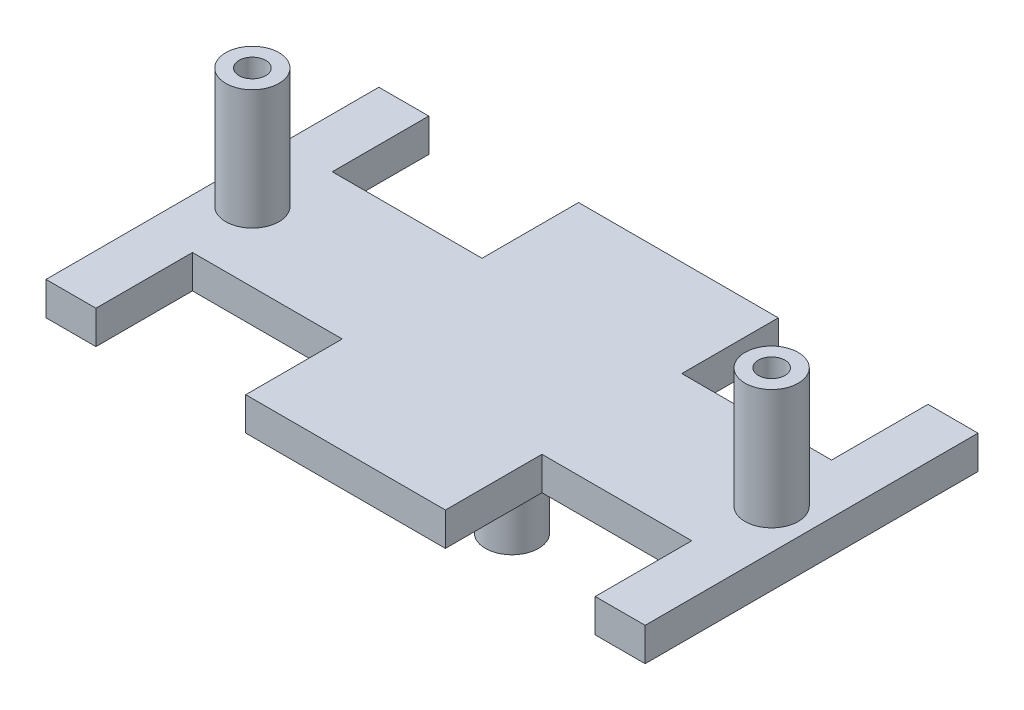
ISO-10303-21;
HEADER;
FILE_DESCRIPTION(('STEP AP214'),'2;1');
FILE_NAME('part.step','',(''),(''),'','','');
FILE_SCHEMA(('AUTOMOTIVE_DESIGN { 1 0 10303 214 1 1 1 1 }'));
ENDSEC;
DATA;
#1=APPLICATION_CONTEXT('core data for automotive mechanical design processes');
#2=APPLICATION_PROTOCOL_DEFINITION('international standard','automotive_design',2000,#1);
#3=PRODUCT_CONTEXT('',#1,'mechanical');
#4=PRODUCT('Part','Part','',(#3));
#5=PRODUCT_RELATED_PRODUCT_CATEGORY('part','',(#4));
#6=PRODUCT_DEFINITION_FORMATION('','',#4);
#7=PRODUCT_DEFINITION_CONTEXT('part definition',#1,'design');
#8=PRODUCT_DEFINITION('design','',#6,#7);
#9=PRODUCT_DEFINITION_SHAPE('','',#8);
#10=(LENGTH_UNIT() NAMED_UNIT(*) SI_UNIT(.MILLI.,.METRE.));
#11=(NAMED_UNIT(*) PLANE_ANGLE_UNIT() SI_UNIT($,.RADIAN.));
#12=(NAMED_UNIT(*) SI_UNIT($,.STERADIAN.) SOLID_ANGLE_UNIT());
#13=UNCERTAINTY_MEASURE_WITH_UNIT(LENGTH_MEASURE(1.E-05),#10,'distance_accuracy_value','');
#14=(GEOMETRIC_REPRESENTATION_CONTEXT(3) GLOBAL_UNCERTAINTY_ASSIGNED_CONTEXT((#13)) GLOBAL_UNIT_ASSIGNED_CONTEXT((#10,
#11,#12)) REPRESENTATION_CONTEXT('',''));
#15=CARTESIAN_POINT('',(0.,0.,0.));
#16=DIRECTION('',(0.,0.,1.));
#17=DIRECTION('',(1.,0.,0.));
#18=AXIS2_PLACEMENT_3D('',#15,#16,#17);
#19=CARTESIAN_POINT('',(0.,5.,0.));
#20=DIRECTION('',(0.,1.,0.));
#21=DIRECTION('',(0.,0.,1.));
#22=AXIS2_PLACEMENT_3D('',#19,#20,#21);
#23=PLANE('',#22);
#24=CARTESIAN_POINT('',(-113.593596059113,5.,-13.9039408866995));
#25=DIRECTION('',(0.,1.,0.));
#26=DIRECTION('',(0.,0.,1.));
#27=AXIS2_PLACEMENT_3D('',#24,#25,#26);
#28=CIRCLE('',#27,4.);
#29=CARTESIAN_POINT('',(-113.593596059113,5.,-9.90394088669952));
#30=VERTEX_POINT('',#29);
#31=EDGE_CURVE('E47',#30,#30,#28,.T.);
#32=ORIENTED_EDGE('',*,*,#31,.F.);
#33=EDGE_LOOP('',(#32));
#34=FACE_BOUND('',#33,.T.);
#35=CARTESIAN_POINT('',(-35.5935960591133,5.,-13.9039408866995));
#36=DIRECTION('',(0.,1.,0.));
#37=DIRECTION('',(0.,0.,1.));
#38=AXIS2_PLACEMENT_3D('',#35,#36,#37);
#39=CIRCLE('',#38,4.);
#40=CARTESIAN_POINT('',(-35.5935960591133,5.,-9.90394088669952));
#41=VERTEX_POINT('',#40);
#42=EDGE_CURVE('E204',#41,#41,#39,.T.);
#43=ORIENTED_EDGE('',*,*,#42,.F.);
#44=EDGE_LOOP('',(#43));
#45=FACE_BOUND('',#44,.T.);
#46=DIRECTION('',(-1.,0.,0.));
#47=VECTOR('',#46,1.);
#48=CARTESIAN_POINT('',(-37.0935960591133,5.,-24.4039408866995));
#49=LINE('',#48,#47);
#50=CARTESIAN_POINT('',(-37.0935960591133,5.,-24.4039408866995));
#51=VERTEX_POINT('',#50);
#52=CARTESIAN_POINT('',(-59.5935960591133,5.,-24.4039408866995));
#53=VERTEX_POINT('',#52);
#54=EDGE_CURVE('E201',#51,#53,#49,.T.);
#55=ORIENTED_EDGE('',*,*,#54,.T.);
#56=DIRECTION('',(0.,0.,-1.));
#57=VECTOR('',#56,1.);
#58=CARTESIAN_POINT('',(-59.5935960591133,5.,-24.4039408866995));
#59=LINE('',#58,#57);
#60=CARTESIAN_POINT('',(-59.5935960591133,5.,-38.9039408866995));
#61=VERTEX_POINT('',#60);
#62=EDGE_CURVE('E193',#53,#61,#59,.T.);
#63=ORIENTED_EDGE('',*,*,#62,.T.);
#64=DIRECTION('',(-1.,0.,0.));
#65=VECTOR('',#64,1.);
#66=CARTESIAN_POINT('',(-119.593596059113,5.,-38.9039408866995));
#67=LINE('',#66,#65);
#68=CARTESIAN_POINT('',(-89.5935960591133,5.,-38.9039408866995));
#69=VERTEX_POINT('',#68);
#70=EDGE_CURVE('E301',#61,#69,#67,.T.);
#71=ORIENTED_EDGE('',*,*,#70,.T.);
#72=DIRECTION('',(0.,0.,-1.));
#73=VECTOR('',#72,1.);
#74=CARTESIAN_POINT('',(-89.5935960591133,5.,-24.4039408866995));
#75=LINE('',#74,#73);
#76=CARTESIAN_POINT('',(-89.5935960591133,5.,-24.4039408866995));
#77=VERTEX_POINT('',#76);
#78=EDGE_CURVE('E259',#77,#69,#75,.T.);
#79=ORIENTED_EDGE('',*,*,#78,.F.);
#80=DIRECTION('',(1.,0.,0.));
#81=VECTOR('',#80,1.);
#82=CARTESIAN_POINT('',(-90.0935960591133,5.,-24.4039408866995));
#83=LINE('',#82,#81);
#84=CARTESIAN_POINT('',(-112.093596059113,5.,-24.4039408866995));
#85=VERTEX_POINT('',#84);
#86=EDGE_CURVE('E269',#85,#77,#83,.T.);
#87=ORIENTED_EDGE('',*,*,#86,.F.);
#88=DIRECTION('',(0.,0.,1.));
#89=VECTOR('',#88,1.);
#90=CARTESIAN_POINT('',(-112.093596059113,5.,-24.4039408866995));
#91=LINE('',#90,#89);
#92=CARTESIAN_POINT('',(-112.093596059113,5.,-38.9039408866995));
#93=VERTEX_POINT('',#92);
#94=EDGE_CURVE('E278',#93,#85,#91,.T.);
#95=ORIENTED_EDGE('',*,*,#94,.F.);
#96=CARTESIAN_POINT('',(-119.593596059113,5.,-38.9039408866995));
#97=VERTEX_POINT('',#96);
#98=EDGE_CURVE('E295',#93,#97,#67,.T.);
#99=ORIENTED_EDGE('',*,*,#98,.T.);
#100=DIRECTION('',(0.,0.,1.));
#101=VECTOR('',#100,1.);
#102=CARTESIAN_POINT('',(-119.593596059113,5.,-38.9039408866995));
#103=LINE('',#102,#101);
#104=CARTESIAN_POINT('',(-119.593596059113,5.,11.0960591133005));
#105=VERTEX_POINT('',#104);
#106=EDGE_CURVE('E300',#97,#105,#103,.T.);
#107=ORIENTED_EDGE('',*,*,#106,.T.);
#108=DIRECTION('',(1.,0.,0.));
#109=VECTOR('',#108,1.);
#110=CARTESIAN_POINT('',(-119.593596059113,5.,11.0960591133005));
#111=LINE('',#110,#109);
#112=CARTESIAN_POINT('',(-112.093596059113,5.,11.0960591133005));
#113=VERTEX_POINT('',#112);
#114=EDGE_CURVE('E304',#105,#113,#111,.T.);
#115=ORIENTED_EDGE('',*,*,#114,.T.);
#116=DIRECTION('',(0.,0.,-1.));
#117=VECTOR('',#116,1.);
#118=CARTESIAN_POINT('',(-112.093596059113,5.,-3.4039408866995));
#119=LINE('',#118,#117);
#120=CARTESIAN_POINT('',(-112.093596059113,5.,-3.4039408866995));
#121=VERTEX_POINT('',#120);
#122=EDGE_CURVE('E244',#113,#121,#119,.T.);
#123=ORIENTED_EDGE('',*,*,#122,.T.);
#124=DIRECTION('',(1.,0.,0.));
#125=VECTOR('',#124,1.);
#126=CARTESIAN_POINT('',(-112.093596059113,5.,-3.4039408866995));
#127=LINE('',#126,#125);
#128=CARTESIAN_POINT('',(-89.5935960591133,5.,-3.40394088669951));
#129=VERTEX_POINT('',#128);
#130=EDGE_CURVE('E252',#121,#129,#127,.T.);
#131=ORIENTED_EDGE('',*,*,#130,.T.);
#132=DIRECTION('',(0.,0.,1.));
#133=VECTOR('',#132,1.);
#134=CARTESIAN_POINT('',(-89.5935960591133,5.,-3.40394088669951));
#135=LINE('',#134,#133);
#136=CARTESIAN_POINT('',(-89.5935960591133,5.,11.0960591133005));
#137=VERTEX_POINT('',#136);
#138=EDGE_CURVE('E234',#129,#137,#135,.T.);
#139=ORIENTED_EDGE('',*,*,#138,.T.);
#140=CARTESIAN_POINT('',(-59.5935960591133,5.,11.0960591133005));
#141=VERTEX_POINT('',#140);
#142=EDGE_CURVE('E308',#137,#141,#111,.T.);
#143=ORIENTED_EDGE('',*,*,#142,.T.);
#144=DIRECTION('',(0.,0.,1.));
#145=VECTOR('',#144,1.);
#146=CARTESIAN_POINT('',(-59.5935960591133,5.,-3.40394088669951));
#147=LINE('',#146,#145);
#148=CARTESIAN_POINT('',(-59.5935960591133,5.,-3.40394088669951));
#149=VERTEX_POINT('',#148);
#150=EDGE_CURVE('E213',#149,#141,#147,.T.);
#151=ORIENTED_EDGE('',*,*,#150,.F.);
#152=DIRECTION('',(-1.,0.,0.));
#153=VECTOR('',#152,1.);
#154=CARTESIAN_POINT('',(-59.0935960591133,5.,-3.4039408866995));
#155=LINE('',#154,#153);
#156=CARTESIAN_POINT('',(-37.0935960591133,5.,-3.4039408866995));
#157=VERTEX_POINT('',#156);
#158=EDGE_CURVE('E221',#157,#149,#155,.T.);
#159=ORIENTED_EDGE('',*,*,#158,.F.);
#160=DIRECTION('',(0.,0.,-1.));
#161=VECTOR('',#160,1.);
#162=CARTESIAN_POINT('',(-37.0935960591133,5.,-3.4039408866995));
#163=LINE('',#162,#161);
#164=CARTESIAN_POINT('',(-37.0935960591133,5.,11.0960591133005));
#165=VERTEX_POINT('',#164);
#166=EDGE_CURVE('E227',#165,#157,#163,.T.);
#167=ORIENTED_EDGE('',*,*,#166,.F.);
#168=CARTESIAN_POINT('',(-29.5935960591133,5.,11.0960591133005));
#169=VERTEX_POINT('',#168);
#170=EDGE_CURVE('E303',#165,#169,#111,.T.);
#171=ORIENTED_EDGE('',*,*,#170,.T.);
#172=DIRECTION('',(0.,0.,-1.));
#173=VECTOR('',#172,1.);
#174=CARTESIAN_POINT('',(-29.5935960591133,5.,-38.9039408866995));
#175=LINE('',#174,#173);
#176=CARTESIAN_POINT('',(-29.5935960591133,5.,-38.9039408866995));
#177=VERTEX_POINT('',#176);
#178=EDGE_CURVE('E292',#169,#177,#175,.T.);
#179=ORIENTED_EDGE('',*,*,#178,.T.);
#180=CARTESIAN_POINT('',(-37.0935960591133,5.,-38.9039408866995));
#181=VERTEX_POINT('',#180);
#182=EDGE_CURVE('E297',#177,#181,#67,.T.);
#183=ORIENTED_EDGE('',*,*,#182,.T.);
#184=DIRECTION('',(0.,0.,1.));
#185=VECTOR('',#184,1.);
#186=CARTESIAN_POINT('',(-37.0935960591133,5.,-24.4039408866995));
#187=LINE('',#186,#185);
#188=EDGE_CURVE('E54',#181,#51,#187,.T.);
#189=ORIENTED_EDGE('',*,*,#188,.T.);
#190=EDGE_LOOP('',(#55,#63,#71,#79,#87,#95,#99,#107,#115,#123,#131,#139,#143,#151,#159,#167,
#171,#179,#183,#189));
#191=FACE_BOUND('',#190,.T.);
#192=ADVANCED_FACE('F39',(#34,#45,#191),#23,.T.);
#193=CARTESIAN_POINT('',(0.,0.,0.));
#194=DIRECTION('',(0.,1.,0.));
#195=DIRECTION('',(0.,0.,1.));
#196=AXIS2_PLACEMENT_3D('',#193,#194,#195);
#197=PLANE('',#196);
#198=CARTESIAN_POINT('',(-74.5935960591133,0.,-13.9039408866995));
#199=DIRECTION('',(0.,1.,0.));
#200=DIRECTION('',(0.,0.,1.));
#201=AXIS2_PLACEMENT_3D('',#198,#199,#200);
#202=CIRCLE('',#201,4.00000000000001);
#203=CARTESIAN_POINT('',(-74.5935960591133,0.,-9.90394088669951));
#204=VERTEX_POINT('',#203);
#205=EDGE_CURVE('E11',#204,#204,#202,.F.);
#206=ORIENTED_EDGE('',*,*,#205,.F.);
#207=EDGE_LOOP('',(#206));
#208=FACE_BOUND('',#207,.T.);
#209=DIRECTION('',(0.,0.,-1.));
#210=VECTOR('',#209,1.);
#211=CARTESIAN_POINT('',(-59.5935960591133,0.,-24.4039408866995));
#212=LINE('',#211,#210);
#213=CARTESIAN_POINT('',(-59.5935960591133,0.,-24.4039408866995));
#214=VERTEX_POINT('',#213);
#215=CARTESIAN_POINT('',(-59.5935960591133,0.,-38.9039408866995));
#216=VERTEX_POINT('',#215);
#217=EDGE_CURVE('E187',#214,#216,#212,.T.);
#218=ORIENTED_EDGE('',*,*,#217,.F.);
#219=DIRECTION('',(-1.,0.,0.));
#220=VECTOR('',#219,1.);
#221=CARTESIAN_POINT('',(-59.0935960591133,0.,-24.4039408866995));
#222=LINE('',#221,#220);
#223=CARTESIAN_POINT('',(-37.0935960591133,0.,-24.4039408866995));
#224=VERTEX_POINT('',#223);
#225=EDGE_CURVE('E176',#224,#214,#222,.T.);
#226=ORIENTED_EDGE('',*,*,#225,.F.);
#227=DIRECTION('',(0.,0.,1.));
#228=VECTOR('',#227,1.);
#229=CARTESIAN_POINT('',(-37.0935960591133,0.,-24.4039408866995));
#230=LINE('',#229,#228);
#231=CARTESIAN_POINT('',(-37.0935960591133,0.,-38.9039408866995));
#232=VERTEX_POINT('',#231);
#233=EDGE_CURVE('E186',#232,#224,#230,.T.);
#234=ORIENTED_EDGE('',*,*,#233,.F.);
#235=DIRECTION('',(-1.,0.,0.));
#236=VECTOR('',#235,1.);
#237=CARTESIAN_POINT('',(-119.593596059113,0.,-38.9039408866995));
#238=LINE('',#237,#236);
#239=CARTESIAN_POINT('',(-29.5935960591133,0.,-38.9039408866995));
#240=VERTEX_POINT('',#239);
#241=EDGE_CURVE('E312',#240,#232,#238,.T.);
#242=ORIENTED_EDGE('',*,*,#241,.F.);
#243=DIRECTION('',(0.,0.,-1.));
#244=VECTOR('',#243,1.);
#245=CARTESIAN_POINT('',(-29.5935960591133,0.,-38.9039408866995));
#246=LINE('',#245,#244);
#247=CARTESIAN_POINT('',(-29.5935960591133,0.,11.0960591133005));
#248=VERTEX_POINT('',#247);
#249=EDGE_CURVE('E285',#248,#240,#246,.T.);
#250=ORIENTED_EDGE('',*,*,#249,.F.);
#251=DIRECTION('',(1.,0.,0.));
#252=VECTOR('',#251,1.);
#253=CARTESIAN_POINT('',(-119.593596059113,0.,11.0960591133005));
#254=LINE('',#253,#252);
#255=CARTESIAN_POINT('',(-37.0935960591133,0.,11.0960591133005));
#256=VERTEX_POINT('',#255);
#257=EDGE_CURVE('E317',#256,#248,#254,.T.);
#258=ORIENTED_EDGE('',*,*,#257,.F.);
#259=DIRECTION('',(0.,0.,-1.));
#260=VECTOR('',#259,1.);
#261=CARTESIAN_POINT('',(-37.0935960591133,0.,-3.4039408866995));
#262=LINE('',#261,#260);
#263=CARTESIAN_POINT('',(-37.0935960591133,0.,-3.4039408866995));
#264=VERTEX_POINT('',#263);
#265=EDGE_CURVE('E220',#256,#264,#262,.T.);
#266=ORIENTED_EDGE('',*,*,#265,.T.);
#267=DIRECTION('',(-1.,0.,0.));
#268=VECTOR('',#267,1.);
#269=CARTESIAN_POINT('',(-37.0935960591133,0.,-3.4039408866995));
#270=LINE('',#269,#268);
#271=CARTESIAN_POINT('',(-59.5935960591133,0.,-3.40394088669951));
#272=VERTEX_POINT('',#271);
#273=EDGE_CURVE('E62',#264,#272,#270,.T.);
#274=ORIENTED_EDGE('',*,*,#273,.T.);
#275=DIRECTION('',(0.,0.,1.));
#276=VECTOR('',#275,1.);
#277=CARTESIAN_POINT('',(-59.5935960591133,0.,-3.40394088669951));
#278=LINE('',#277,#276);
#279=CARTESIAN_POINT('',(-59.5935960591133,0.,11.0960591133005));
#280=VERTEX_POINT('',#279);
#281=EDGE_CURVE('E217',#272,#280,#278,.T.);
#282=ORIENTED_EDGE('',*,*,#281,.T.);
#283=CARTESIAN_POINT('',(-89.5935960591133,0.,11.0960591133005));
#284=VERTEX_POINT('',#283);
#285=EDGE_CURVE('E320',#284,#280,#254,.T.);
#286=ORIENTED_EDGE('',*,*,#285,.F.);
#287=DIRECTION('',(0.,0.,1.));
#288=VECTOR('',#287,1.);
#289=CARTESIAN_POINT('',(-89.5935960591133,0.,-3.40394088669951));
#290=LINE('',#289,#288);
#291=CARTESIAN_POINT('',(-89.5935960591133,0.,-3.40394088669951));
#292=VERTEX_POINT('',#291);
#293=EDGE_CURVE('E241',#292,#284,#290,.T.);
#294=ORIENTED_EDGE('',*,*,#293,.F.);
#295=DIRECTION('',(1.,0.,0.));
#296=VECTOR('',#295,1.);
#297=CARTESIAN_POINT('',(-90.0935960591133,0.,-3.4039408866995));
#298=LINE('',#297,#296);
#299=CARTESIAN_POINT('',(-112.093596059113,0.,-3.4039408866995));
#300=VERTEX_POINT('',#299);
#301=EDGE_CURVE('E243',#300,#292,#298,.T.);
#302=ORIENTED_EDGE('',*,*,#301,.F.);
#303=DIRECTION('',(0.,0.,-1.));
#304=VECTOR('',#303,1.);
#305=CARTESIAN_POINT('',(-112.093596059113,0.,-3.4039408866995));
#306=LINE('',#305,#304);
#307=CARTESIAN_POINT('',(-112.093596059113,0.,11.0960591133005));
#308=VERTEX_POINT('',#307);
#309=EDGE_CURVE('E246',#308,#300,#306,.T.);
#310=ORIENTED_EDGE('',*,*,#309,.F.);
#311=CARTESIAN_POINT('',(-119.593596059113,0.,11.0960591133005));
#312=VERTEX_POINT('',#311);
#313=EDGE_CURVE('E296',#312,#308,#254,.T.);
#314=ORIENTED_EDGE('',*,*,#313,.F.);
#315=DIRECTION('',(0.,0.,1.));
#316=VECTOR('',#315,1.);
#317=CARTESIAN_POINT('',(-119.593596059113,0.,-38.9039408866995));
#318=LINE('',#317,#316);
#319=CARTESIAN_POINT('',(-119.593596059113,0.,-38.9039408866995));
#320=VERTEX_POINT('',#319);
#321=EDGE_CURVE('E315',#320,#312,#318,.T.);
#322=ORIENTED_EDGE('',*,*,#321,.F.);
#323=CARTESIAN_POINT('',(-112.093596059113,0.,-38.9039408866995));
#324=VERTEX_POINT('',#323);
#325=EDGE_CURVE('E311',#324,#320,#238,.T.);
#326=ORIENTED_EDGE('',*,*,#325,.F.);
#327=DIRECTION('',(0.,0.,1.));
#328=VECTOR('',#327,1.);
#329=CARTESIAN_POINT('',(-112.093596059113,0.,-24.4039408866995));
#330=LINE('',#329,#328);
#331=CARTESIAN_POINT('',(-112.093596059113,0.,-24.4039408866995));
#332=VERTEX_POINT('',#331);
#333=EDGE_CURVE('E268',#324,#332,#330,.T.);
#334=ORIENTED_EDGE('',*,*,#333,.T.);
#335=DIRECTION('',(1.,0.,0.));
#336=VECTOR('',#335,1.);
#337=CARTESIAN_POINT('',(-112.093596059113,0.,-24.4039408866995));
#338=LINE('',#337,#336);
#339=CARTESIAN_POINT('',(-89.5935960591133,0.,-24.4039408866995));
#340=VERTEX_POINT('',#339);
#341=EDGE_CURVE('E272',#332,#340,#338,.T.);
#342=ORIENTED_EDGE('',*,*,#341,.T.);
#343=DIRECTION('',(0.,0.,-1.));
#344=VECTOR('',#343,1.);
#345=CARTESIAN_POINT('',(-89.5935960591133,0.,-24.4039408866995));
#346=LINE('',#345,#344);
#347=CARTESIAN_POINT('',(-89.5935960591133,0.,-38.9039408866995));
#348=VERTEX_POINT('',#347);
#349=EDGE_CURVE('E266',#340,#348,#346,.T.);
#350=ORIENTED_EDGE('',*,*,#349,.T.);
#351=EDGE_CURVE('E199',#216,#348,#238,.T.);
#352=ORIENTED_EDGE('',*,*,#351,.F.);
#353=EDGE_LOOP('',(#218,#226,#234,#242,#250,#258,#266,#274,#282,#286,#294,#302,#310,#314,#322,
#326,#334,#342,#350,#352));
#354=FACE_BOUND('',#353,.T.);
#355=ADVANCED_FACE('F197',(#208,#354),#197,.F.);
#356=CARTESIAN_POINT('',(-119.593596059113,5.,-38.9039408866995));
#357=DIRECTION('',(0.,0.,1.));
#358=DIRECTION('',(1.,0.,0.));
#359=AXIS2_PLACEMENT_3D('',#356,#357,#358);
#360=PLANE('',#359);
#361=DIRECTION('',(0.,1.,0.));
#362=VECTOR('',#361,1.);
#363=CARTESIAN_POINT('',(-59.5935960591133,0.,-38.9039408866995));
#364=LINE('',#363,#362);
#365=EDGE_CURVE('E211',#216,#61,#364,.T.);
#366=ORIENTED_EDGE('',*,*,#365,.F.);
#367=ORIENTED_EDGE('',*,*,#351,.T.);
#368=DIRECTION('',(0.,1.,0.));
#369=VECTOR('',#368,1.);
#370=CARTESIAN_POINT('',(-89.5935960591133,0.,-38.9039408866995));
#371=LINE('',#370,#369);
#372=EDGE_CURVE('E275',#348,#69,#371,.T.);
#373=ORIENTED_EDGE('',*,*,#372,.T.);
#374=ORIENTED_EDGE('',*,*,#70,.F.);
#375=EDGE_LOOP('',(#366,#367,#373,#374));
#376=FACE_BOUND('',#375,.T.);
#377=ADVANCED_FACE('F413',(#376),#360,.F.);
#378=DIRECTION('',(0.,1.,0.));
#379=VECTOR('',#378,1.);
#380=CARTESIAN_POINT('',(-37.0935960591133,0.,-38.9039408866995));
#381=LINE('',#380,#379);
#382=EDGE_CURVE('E214',#232,#181,#381,.T.);
#383=ORIENTED_EDGE('',*,*,#382,.T.);
#384=ORIENTED_EDGE('',*,*,#182,.F.);
#385=DIRECTION('',(0.,-1.,0.));
#386=VECTOR('',#385,1.);
#387=CARTESIAN_POINT('',(-29.5935960591133,5.,-38.9039408866995));
#388=LINE('',#387,#386);
#389=EDGE_CURVE('E329',#177,#240,#388,.T.);
#390=ORIENTED_EDGE('',*,*,#389,.T.);
#391=ORIENTED_EDGE('',*,*,#241,.T.);
#392=EDGE_LOOP('',(#383,#384,#390,#391));
#393=FACE_BOUND('',#392,.T.);
#394=ADVANCED_FACE('F346',(#393),#360,.F.);
#395=CARTESIAN_POINT('',(-119.593596059113,5.,11.0960591133005));
#396=DIRECTION('',(0.,0.,-1.));
#397=DIRECTION('',(-1.,0.,0.));
#398=AXIS2_PLACEMENT_3D('',#395,#396,#397);
#399=PLANE('',#398);
#400=ORIENTED_EDGE('',*,*,#285,.T.);
#401=DIRECTION('',(0.,1.,0.));
#402=VECTOR('',#401,1.);
#403=CARTESIAN_POINT('',(-59.5935960591133,0.,11.0960591133005));
#404=LINE('',#403,#402);
#405=EDGE_CURVE('E225',#280,#141,#404,.T.);
#406=ORIENTED_EDGE('',*,*,#405,.T.);
#407=ORIENTED_EDGE('',*,*,#142,.F.);
#408=DIRECTION('',(0.,1.,0.));
#409=VECTOR('',#408,1.);
#410=CARTESIAN_POINT('',(-89.5935960591133,0.,11.0960591133005));
#411=LINE('',#410,#409);
#412=EDGE_CURVE('E257',#284,#137,#411,.T.);
#413=ORIENTED_EDGE('',*,*,#412,.F.);
#414=EDGE_LOOP('',(#400,#406,#407,#413));
#415=FACE_BOUND('',#414,.T.);
#416=ADVANCED_FACE('F360',(#415),#399,.F.);
#417=ORIENTED_EDGE('',*,*,#170,.F.);
#418=DIRECTION('',(0.,1.,0.));
#419=VECTOR('',#418,1.);
#420=CARTESIAN_POINT('',(-37.0935960591133,0.,11.0960591133005));
#421=LINE('',#420,#419);
#422=EDGE_CURVE('E237',#256,#165,#421,.T.);
#423=ORIENTED_EDGE('',*,*,#422,.F.);
#424=ORIENTED_EDGE('',*,*,#257,.T.);
#425=DIRECTION('',(0.,-1.,0.));
#426=VECTOR('',#425,1.);
#427=CARTESIAN_POINT('',(-29.5935960591133,5.,11.0960591133005));
#428=LINE('',#427,#426);
#429=EDGE_CURVE('E307',#169,#248,#428,.T.);
#430=ORIENTED_EDGE('',*,*,#429,.F.);
#431=EDGE_LOOP('',(#417,#423,#424,#430));
#432=FACE_BOUND('',#431,.T.);
#433=ADVANCED_FACE('F354',(#432),#399,.F.);
#434=DIRECTION('',(0.,1.,0.));
#435=VECTOR('',#434,1.);
#436=CARTESIAN_POINT('',(-112.093596059113,0.,11.0960591133005));
#437=LINE('',#436,#435);
#438=EDGE_CURVE('E260',#308,#113,#437,.T.);
#439=ORIENTED_EDGE('',*,*,#438,.T.);
#440=ORIENTED_EDGE('',*,*,#114,.F.);
#441=DIRECTION('',(0.,-1.,0.));
#442=VECTOR('',#441,1.);
#443=CARTESIAN_POINT('',(-119.593596059113,5.,11.0960591133005));
#444=LINE('',#443,#442);
#445=EDGE_CURVE('E323',#105,#312,#444,.T.);
#446=ORIENTED_EDGE('',*,*,#445,.T.);
#447=ORIENTED_EDGE('',*,*,#313,.T.);
#448=EDGE_LOOP('',(#439,#440,#446,#447));
#449=FACE_BOUND('',#448,.T.);
#450=ADVANCED_FACE('F417',(#449),#399,.F.);
#451=CARTESIAN_POINT('',(-29.5935960591133,5.,-38.9039408866995));
#452=DIRECTION('',(-1.,0.,0.));
#453=DIRECTION('',(0.,0.,1.));
#454=AXIS2_PLACEMENT_3D('',#451,#452,#453);
#455=PLANE('',#454);
#456=ORIENTED_EDGE('',*,*,#249,.T.);
#457=ORIENTED_EDGE('',*,*,#389,.F.);
#458=ORIENTED_EDGE('',*,*,#178,.F.);
#459=ORIENTED_EDGE('',*,*,#429,.T.);
#460=EDGE_LOOP('',(#456,#457,#458,#459));
#461=FACE_BOUND('',#460,.T.);
#462=ADVANCED_FACE('F41',(#461),#455,.F.);
#463=ORIENTED_EDGE('',*,*,#98,.F.);
#464=DIRECTION('',(0.,1.,0.));
#465=VECTOR('',#464,1.);
#466=CARTESIAN_POINT('',(-112.093596059113,0.,-38.9039408866995));
#467=LINE('',#466,#465);
#468=EDGE_CURVE('E288',#324,#93,#467,.T.);
#469=ORIENTED_EDGE('',*,*,#468,.F.);
#470=ORIENTED_EDGE('',*,*,#325,.T.);
#471=DIRECTION('',(0.,-1.,0.));
#472=VECTOR('',#471,1.);
#473=CARTESIAN_POINT('',(-119.593596059113,5.,-38.9039408866995));
#474=LINE('',#473,#472);
#475=EDGE_CURVE('E326',#97,#320,#474,.T.);
#476=ORIENTED_EDGE('',*,*,#475,.F.);
#477=EDGE_LOOP('',(#463,#469,#470,#476));
#478=FACE_BOUND('',#477,.T.);
#479=ADVANCED_FACE('F419',(#478),#360,.F.);
#480=CARTESIAN_POINT('',(-119.593596059113,5.,-38.9039408866995));
#481=DIRECTION('',(1.,0.,0.));
#482=DIRECTION('',(0.,0.,-1.));
#483=AXIS2_PLACEMENT_3D('',#480,#481,#482);
#484=PLANE('',#483);
#485=ORIENTED_EDGE('',*,*,#321,.T.);
#486=ORIENTED_EDGE('',*,*,#445,.F.);
#487=ORIENTED_EDGE('',*,*,#106,.F.);
#488=ORIENTED_EDGE('',*,*,#475,.T.);
#489=EDGE_LOOP('',(#485,#486,#487,#488));
#490=FACE_BOUND('',#489,.T.);
#491=ADVANCED_FACE('F408',(#490),#484,.F.);
#492=CARTESIAN_POINT('',(-89.5935960591133,0.,-24.4039408866995));
#493=DIRECTION('',(1.,0.,0.));
#494=DIRECTION('',(0.,0.,-1.));
#495=AXIS2_PLACEMENT_3D('',#492,#493,#494);
#496=PLANE('',#495);
#497=ORIENTED_EDGE('',*,*,#78,.T.);
#498=ORIENTED_EDGE('',*,*,#372,.F.);
#499=ORIENTED_EDGE('',*,*,#349,.F.);
#500=DIRECTION('',(0.,1.,0.));
#501=VECTOR('',#500,1.);
#502=CARTESIAN_POINT('',(-89.5935960591133,0.,-24.4039408866995));
#503=LINE('',#502,#501);
#504=EDGE_CURVE('E283',#340,#77,#503,.T.);
#505=ORIENTED_EDGE('',*,*,#504,.T.);
#506=EDGE_LOOP('',(#497,#498,#499,#505));
#507=FACE_BOUND('',#506,.T.);
#508=ADVANCED_FACE('F402',(#507),#496,.F.);
#509=CARTESIAN_POINT('',(-90.0935960591133,0.,-24.4039408866995));
#510=DIRECTION('',(0.,0.,1.));
#511=DIRECTION('',(1.,0.,0.));
#512=AXIS2_PLACEMENT_3D('',#509,#510,#511);
#513=PLANE('',#512);
#514=ORIENTED_EDGE('',*,*,#86,.T.);
#515=ORIENTED_EDGE('',*,*,#504,.F.);
#516=ORIENTED_EDGE('',*,*,#341,.F.);
#517=DIRECTION('',(0.,1.,0.));
#518=VECTOR('',#517,1.);
#519=CARTESIAN_POINT('',(-112.093596059113,0.,-24.4039408866995));
#520=LINE('',#519,#518);
#521=EDGE_CURVE('E286',#332,#85,#520,.T.);
#522=ORIENTED_EDGE('',*,*,#521,.T.);
#523=EDGE_LOOP('',(#514,#515,#516,#522));
#524=FACE_BOUND('',#523,.T.);
#525=ADVANCED_FACE('F399',(#524),#513,.F.);
#526=CARTESIAN_POINT('',(-112.093596059113,0.,-24.4039408866995));
#527=DIRECTION('',(-1.,0.,0.));
#528=DIRECTION('',(0.,0.,1.));
#529=AXIS2_PLACEMENT_3D('',#526,#527,#528);
#530=PLANE('',#529);
#531=ORIENTED_EDGE('',*,*,#94,.T.);
#532=ORIENTED_EDGE('',*,*,#521,.F.);
#533=ORIENTED_EDGE('',*,*,#333,.F.);
#534=ORIENTED_EDGE('',*,*,#468,.T.);
#535=EDGE_LOOP('',(#531,#532,#533,#534));
#536=FACE_BOUND('',#535,.T.);
#537=ADVANCED_FACE('F397',(#536),#530,.F.);
#538=CARTESIAN_POINT('',(-89.5935960591133,0.,-3.40394088669951));
#539=DIRECTION('',(-1.,0.,0.));
#540=DIRECTION('',(0.,0.,1.));
#541=AXIS2_PLACEMENT_3D('',#538,#539,#540);
#542=PLANE('',#541);
#543=ORIENTED_EDGE('',*,*,#138,.F.);
#544=DIRECTION('',(0.,1.,0.));
#545=VECTOR('',#544,1.);
#546=CARTESIAN_POINT('',(-89.5935960591133,0.,-3.40394088669951));
#547=LINE('',#546,#545);
#548=EDGE_CURVE('E249',#292,#129,#547,.T.);
#549=ORIENTED_EDGE('',*,*,#548,.F.);
#550=ORIENTED_EDGE('',*,*,#293,.T.);
#551=ORIENTED_EDGE('',*,*,#412,.T.);
#552=EDGE_LOOP('',(#543,#549,#550,#551));
#553=FACE_BOUND('',#552,.T.);
#554=ADVANCED_FACE('F390',(#553),#542,.T.);
#555=CARTESIAN_POINT('',(-112.093596059113,0.,-3.4039408866995));
#556=DIRECTION('',(1.,0.,0.));
#557=DIRECTION('',(0.,0.,-1.));
#558=AXIS2_PLACEMENT_3D('',#555,#556,#557);
#559=PLANE('',#558);
#560=ORIENTED_EDGE('',*,*,#122,.F.);
#561=ORIENTED_EDGE('',*,*,#438,.F.);
#562=ORIENTED_EDGE('',*,*,#309,.T.);
#563=DIRECTION('',(0.,1.,0.));
#564=VECTOR('',#563,1.);
#565=CARTESIAN_POINT('',(-112.093596059113,0.,-3.4039408866995));
#566=LINE('',#565,#564);
#567=EDGE_CURVE('E263',#300,#121,#566,.T.);
#568=ORIENTED_EDGE('',*,*,#567,.T.);
#569=EDGE_LOOP('',(#560,#561,#562,#568));
#570=FACE_BOUND('',#569,.T.);
#571=ADVANCED_FACE('F387',(#570),#559,.T.);
#572=CARTESIAN_POINT('',(-112.093596059113,0.,-3.4039408866995));
#573=DIRECTION('',(0.,0.,1.));
#574=DIRECTION('',(1.,0.,0.));
#575=AXIS2_PLACEMENT_3D('',#572,#573,#574);
#576=PLANE('',#575);
#577=ORIENTED_EDGE('',*,*,#130,.F.);
#578=ORIENTED_EDGE('',*,*,#567,.F.);
#579=ORIENTED_EDGE('',*,*,#301,.T.);
#580=ORIENTED_EDGE('',*,*,#548,.T.);
#581=EDGE_LOOP('',(#577,#578,#579,#580));
#582=FACE_BOUND('',#581,.T.);
#583=ADVANCED_FACE('F382',(#582),#576,.T.);
#584=CARTESIAN_POINT('',(-59.5935960591133,0.,-3.40394088669951));
#585=DIRECTION('',(-1.,0.,0.));
#586=DIRECTION('',(0.,0.,1.));
#587=AXIS2_PLACEMENT_3D('',#584,#585,#586);
#588=PLANE('',#587);
#589=ORIENTED_EDGE('',*,*,#150,.T.);
#590=ORIENTED_EDGE('',*,*,#405,.F.);
#591=ORIENTED_EDGE('',*,*,#281,.F.);
#592=DIRECTION('',(0.,1.,0.));
#593=VECTOR('',#592,1.);
#594=CARTESIAN_POINT('',(-59.5935960591133,0.,-3.40394088669951));
#595=LINE('',#594,#593);
#596=EDGE_CURVE('E232',#272,#149,#595,.T.);
#597=ORIENTED_EDGE('',*,*,#596,.T.);
#598=EDGE_LOOP('',(#589,#590,#591,#597));
#599=FACE_BOUND('',#598,.T.);
#600=ADVANCED_FACE('F367',(#599),#588,.F.);
#601=CARTESIAN_POINT('',(-59.0935960591133,0.,-3.4039408866995));
#602=DIRECTION('',(0.,0.,-1.));
#603=DIRECTION('',(-1.,0.,0.));
#604=AXIS2_PLACEMENT_3D('',#601,#602,#603);
#605=PLANE('',#604);
#606=ORIENTED_EDGE('',*,*,#158,.T.);
#607=ORIENTED_EDGE('',*,*,#596,.F.);
#608=ORIENTED_EDGE('',*,*,#273,.F.);
#609=DIRECTION('',(0.,1.,0.));
#610=VECTOR('',#609,1.);
#611=CARTESIAN_POINT('',(-37.0935960591133,0.,-3.4039408866995));
#612=LINE('',#611,#610);
#613=EDGE_CURVE('E235',#264,#157,#612,.T.);
#614=ORIENTED_EDGE('',*,*,#613,.T.);
#615=EDGE_LOOP('',(#606,#607,#608,#614));
#616=FACE_BOUND('',#615,.T.);
#617=ADVANCED_FACE('F374',(#616),#605,.F.);
#618=CARTESIAN_POINT('',(-37.0935960591133,0.,-3.4039408866995));
#619=DIRECTION('',(1.,0.,0.));
#620=DIRECTION('',(0.,0.,-1.));
#621=AXIS2_PLACEMENT_3D('',#618,#619,#620);
#622=PLANE('',#621);
#623=ORIENTED_EDGE('',*,*,#166,.T.);
#624=ORIENTED_EDGE('',*,*,#613,.F.);
#625=ORIENTED_EDGE('',*,*,#265,.F.);
#626=ORIENTED_EDGE('',*,*,#422,.T.);
#627=EDGE_LOOP('',(#623,#624,#625,#626));
#628=FACE_BOUND('',#627,.T.);
#629=ADVANCED_FACE('F373',(#628),#622,.F.);
#630=CARTESIAN_POINT('',(-59.5935960591133,0.,-24.4039408866995));
#631=DIRECTION('',(1.,0.,0.));
#632=DIRECTION('',(0.,0.,-1.));
#633=AXIS2_PLACEMENT_3D('',#630,#631,#632);
#634=PLANE('',#633);
#635=ORIENTED_EDGE('',*,*,#62,.F.);
#636=DIRECTION('',(0.,1.,0.));
#637=VECTOR('',#636,1.);
#638=CARTESIAN_POINT('',(-59.5935960591133,0.,-24.4039408866995));
#639=LINE('',#638,#637);
#640=EDGE_CURVE('E180',#214,#53,#639,.T.);
#641=ORIENTED_EDGE('',*,*,#640,.F.);
#642=ORIENTED_EDGE('',*,*,#217,.T.);
#643=ORIENTED_EDGE('',*,*,#365,.T.);
#644=EDGE_LOOP('',(#635,#641,#642,#643));
#645=FACE_BOUND('',#644,.T.);
#646=ADVANCED_FACE('F190',(#645),#634,.T.);
#647=CARTESIAN_POINT('',(-37.0935960591133,0.,-24.4039408866995));
#648=DIRECTION('',(-1.,0.,0.));
#649=DIRECTION('',(0.,0.,1.));
#650=AXIS2_PLACEMENT_3D('',#647,#648,#649);
#651=PLANE('',#650);
#652=ORIENTED_EDGE('',*,*,#188,.F.);
#653=ORIENTED_EDGE('',*,*,#382,.F.);
#654=ORIENTED_EDGE('',*,*,#233,.T.);
#655=DIRECTION('',(0.,1.,0.));
#656=VECTOR('',#655,1.);
#657=CARTESIAN_POINT('',(-37.0935960591133,0.,-24.4039408866995));
#658=LINE('',#657,#656);
#659=EDGE_CURVE('E182',#224,#51,#658,.T.);
#660=ORIENTED_EDGE('',*,*,#659,.T.);
#661=EDGE_LOOP('',(#652,#653,#654,#660));
#662=FACE_BOUND('',#661,.T.);
#663=ADVANCED_FACE('F347',(#662),#651,.T.);
#664=CARTESIAN_POINT('',(-37.0935960591133,0.,-24.4039408866995));
#665=DIRECTION('',(0.,0.,-1.));
#666=DIRECTION('',(-1.,0.,0.));
#667=AXIS2_PLACEMENT_3D('',#664,#665,#666);
#668=PLANE('',#667);
#669=ORIENTED_EDGE('',*,*,#54,.F.);
#670=ORIENTED_EDGE('',*,*,#659,.F.);
#671=ORIENTED_EDGE('',*,*,#225,.T.);
#672=ORIENTED_EDGE('',*,*,#640,.T.);
#673=EDGE_LOOP('',(#669,#670,#671,#672));
#674=FACE_BOUND('',#673,.T.);
#675=ADVANCED_FACE('F179',(#674),#668,.T.);
#676=CARTESIAN_POINT('',(-35.5935960591133,23.,-13.9039408866995));
#677=DIRECTION('',(0.,-1.,0.));
#678=DIRECTION('',(0.,0.,-1.));
#679=AXIS2_PLACEMENT_3D('',#676,#677,#678);
#680=CYLINDRICAL_SURFACE('',#679,4.);
#681=CARTESIAN_POINT('',(-35.5935960591133,23.,-13.9039408866995));
#682=DIRECTION('',(0.,1.,0.));
#683=DIRECTION('',(0.,0.,1.));
#684=AXIS2_PLACEMENT_3D('',#681,#682,#683);
#685=CIRCLE('',#684,4.);
#686=CARTESIAN_POINT('',(-35.5935960591133,23.,-9.90394088669952));
#687=VERTEX_POINT('',#686);
#688=EDGE_CURVE('E209',#687,#687,#685,.T.);
#689=ORIENTED_EDGE('',*,*,#688,.F.);
#690=EDGE_LOOP('',(#689));
#691=FACE_BOUND('',#690,.T.);
#692=ORIENTED_EDGE('',*,*,#42,.T.);
#693=EDGE_LOOP('',(#692));
#694=FACE_BOUND('',#693,.T.);
#695=ADVANCED_FACE('F543',(#691,#694),#680,.T.);
#696=CARTESIAN_POINT('',(-35.5935960591133,23.,-13.9039408866995));
#697=DIRECTION('',(0.,1.,0.));
#698=DIRECTION('',(0.,0.,1.));
#699=AXIS2_PLACEMENT_3D('',#696,#697,#698);
#700=PLANE('',#699);
#701=CARTESIAN_POINT('',(-35.5935960591133,23.,-13.9039408866995));
#702=DIRECTION('',(0.,1.,0.));
#703=DIRECTION('',(0.,0.,1.));
#704=AXIS2_PLACEMENT_3D('',#701,#702,#703);
#705=CIRCLE('',#704,2.);
#706=CARTESIAN_POINT('',(-35.5935960591133,23.,-11.9039408866995));
#707=VERTEX_POINT('',#706);
#708=EDGE_CURVE('E682',#707,#707,#705,.T.);
#709=ORIENTED_EDGE('',*,*,#708,.F.);
#710=EDGE_LOOP('',(#709));
#711=FACE_BOUND('',#710,.T.);
#712=ORIENTED_EDGE('',*,*,#688,.T.);
#713=EDGE_LOOP('',(#712));
#714=FACE_BOUND('',#713,.T.);
#715=ADVANCED_FACE('F554',(#711,#714),#700,.T.);
#716=CARTESIAN_POINT('',(-35.5935960591133,5.,-13.9039408866995));
#717=DIRECTION('',(0.,1.,0.));
#718=DIRECTION('',(0.,0.,1.));
#719=AXIS2_PLACEMENT_3D('',#716,#717,#718);
#720=CYLINDRICAL_SURFACE('',#719,2.);
#721=CARTESIAN_POINT('',(-35.5935960591133,5.,-13.9039408866995));
#722=DIRECTION('',(0.,1.,0.));
#723=DIRECTION('',(0.,0.,1.));
#724=AXIS2_PLACEMENT_3D('',#721,#722,#723);
#725=CIRCLE('',#724,2.);
#726=CARTESIAN_POINT('',(-35.5935960591133,5.,-11.9039408866995));
#727=VERTEX_POINT('',#726);
#728=EDGE_CURVE('E683',#727,#727,#725,.T.);
#729=ORIENTED_EDGE('',*,*,#728,.F.);
#730=EDGE_LOOP('',(#729));
#731=FACE_BOUND('',#730,.T.);
#732=ORIENTED_EDGE('',*,*,#708,.T.);
#733=EDGE_LOOP('',(#732));
#734=FACE_BOUND('',#733,.T.);
#735=ADVANCED_FACE('F564',(#731,#734),#720,.F.);
#736=CARTESIAN_POINT('',(-35.5935960591133,5.,-13.9039408866995));
#737=DIRECTION('',(0.,1.,0.));
#738=DIRECTION('',(0.,0.,1.));
#739=AXIS2_PLACEMENT_3D('',#736,#737,#738);
#740=PLANE('',#739);
#741=ORIENTED_EDGE('',*,*,#728,.T.);
#742=EDGE_LOOP('',(#741));
#743=FACE_BOUND('',#742,.T.);
#744=ADVANCED_FACE('F574',(#743),#740,.T.);
#745=CARTESIAN_POINT('',(-113.593596059113,23.,-13.9039408866995));
#746=DIRECTION('',(0.,-1.,0.));
#747=DIRECTION('',(0.,0.,-1.));
#748=AXIS2_PLACEMENT_3D('',#745,#746,#747);
#749=CYLINDRICAL_SURFACE('',#748,4.);
#750=CARTESIAN_POINT('',(-113.593596059113,23.,-13.9039408866995));
#751=DIRECTION('',(0.,-1.,0.));
#752=DIRECTION('',(0.,0.,1.));
#753=AXIS2_PLACEMENT_3D('',#750,#751,#752);
#754=CIRCLE('',#753,4.);
#755=CARTESIAN_POINT('',(-113.593596059113,23.,-9.90394088669952));
#756=VERTEX_POINT('',#755);
#757=EDGE_CURVE('E677',#756,#756,#754,.T.);
#758=ORIENTED_EDGE('',*,*,#757,.T.);
#759=EDGE_LOOP('',(#758));
#760=FACE_BOUND('',#759,.T.);
#761=ORIENTED_EDGE('',*,*,#31,.T.);
#762=EDGE_LOOP('',(#761));
#763=FACE_BOUND('',#762,.T.);
#764=ADVANCED_FACE('F334',(#760,#763),#749,.T.);
#765=CARTESIAN_POINT('',(-113.593596059113,23.,-13.9039408866995));
#766=DIRECTION('',(0.,1.,0.));
#767=DIRECTION('',(0.,0.,1.));
#768=AXIS2_PLACEMENT_3D('',#765,#766,#767);
#769=PLANE('',#768);
#770=CARTESIAN_POINT('',(-113.593596059113,23.,-13.9039408866995));
#771=DIRECTION('',(0.,-1.,0.));
#772=DIRECTION('',(0.,0.,1.));
#773=AXIS2_PLACEMENT_3D('',#770,#771,#772);
#774=CIRCLE('',#773,2.);
#775=CARTESIAN_POINT('',(-113.593596059113,23.,-11.9039408866995));
#776=VERTEX_POINT('',#775);
#777=EDGE_CURVE('E669',#776,#776,#774,.T.);
#778=ORIENTED_EDGE('',*,*,#777,.T.);
#779=EDGE_LOOP('',(#778));
#780=FACE_BOUND('',#779,.T.);
#781=ORIENTED_EDGE('',*,*,#757,.F.);
#782=EDGE_LOOP('',(#781));
#783=FACE_BOUND('',#782,.T.);
#784=ADVANCED_FACE('F591',(#780,#783),#769,.T.);
#785=CARTESIAN_POINT('',(-113.593596059113,5.,-13.9039408866995));
#786=DIRECTION('',(0.,1.,0.));
#787=DIRECTION('',(0.,0.,1.));
#788=AXIS2_PLACEMENT_3D('',#785,#786,#787);
#789=CYLINDRICAL_SURFACE('',#788,2.);
#790=CARTESIAN_POINT('',(-113.593596059113,5.,-13.9039408866995));
#791=DIRECTION('',(0.,-1.,0.));
#792=DIRECTION('',(0.,0.,1.));
#793=AXIS2_PLACEMENT_3D('',#790,#791,#792);
#794=CIRCLE('',#793,2.);
#795=CARTESIAN_POINT('',(-113.593596059113,5.,-11.9039408866995));
#796=VERTEX_POINT('',#795);
#797=EDGE_CURVE('E674',#796,#796,#794,.T.);
#798=ORIENTED_EDGE('',*,*,#797,.T.);
#799=EDGE_LOOP('',(#798));
#800=FACE_BOUND('',#799,.T.);
#801=ORIENTED_EDGE('',*,*,#777,.F.);
#802=EDGE_LOOP('',(#801));
#803=FACE_BOUND('',#802,.T.);
#804=ADVANCED_FACE('F601',(#800,#803),#789,.F.);
#805=CARTESIAN_POINT('',(-113.593596059113,5.,-13.9039408866995));
#806=DIRECTION('',(0.,1.,0.));
#807=DIRECTION('',(0.,0.,1.));
#808=AXIS2_PLACEMENT_3D('',#805,#806,#807);
#809=PLANE('',#808);
#810=ORIENTED_EDGE('',*,*,#797,.F.);
#811=EDGE_LOOP('',(#810));
#812=FACE_BOUND('',#811,.T.);
#813=ADVANCED_FACE('F611',(#812),#809,.T.);
#814=CARTESIAN_POINT('',(-74.5935960591133,-18.,-13.9039408866995));
#815=DIRECTION('',(0.,1.,0.));
#816=DIRECTION('',(0.,0.,1.));
#817=AXIS2_PLACEMENT_3D('',#814,#815,#816);
#818=CYLINDRICAL_SURFACE('',#817,4.00000000000001);
#819=CARTESIAN_POINT('',(-74.5935960591133,-18.,-13.9039408866995));
#820=DIRECTION('',(0.,-1.,0.));
#821=DIRECTION('',(0.,0.,-1.));
#822=AXIS2_PLACEMENT_3D('',#819,#820,#821);
#823=CIRCLE('',#822,4.00000000000001);
#824=CARTESIAN_POINT('',(-74.5935960591133,-18.,-17.9039408866995));
#825=VERTEX_POINT('',#824);
#826=EDGE_CURVE('E665',#825,#825,#823,.T.);
#827=ORIENTED_EDGE('',*,*,#826,.F.);
#828=EDGE_LOOP('',(#827));
#829=FACE_BOUND('',#828,.T.);
#830=ORIENTED_EDGE('',*,*,#205,.T.);
#831=EDGE_LOOP('',(#830));
#832=FACE_BOUND('',#831,.T.);
#833=ADVANCED_FACE('F620',(#829,#832),#818,.T.);
#834=CARTESIAN_POINT('',(-74.5935960591133,-18.,-13.9039408866995));
#835=DIRECTION('',(0.,-1.,0.));
#836=DIRECTION('',(0.,0.,-1.));
#837=AXIS2_PLACEMENT_3D('',#834,#835,#836);
#838=PLANE('',#837);
#839=CARTESIAN_POINT('',(-74.5935960591133,-18.,-13.9039408866995));
#840=DIRECTION('',(0.,-1.,0.));
#841=DIRECTION('',(0.,0.,-1.));
#842=AXIS2_PLACEMENT_3D('',#839,#840,#841);
#843=CIRCLE('',#842,2.);
#844=CARTESIAN_POINT('',(-74.5935960591133,-18.,-15.9039408866995));
#845=VERTEX_POINT('',#844);
#846=EDGE_CURVE('E666',#845,#845,#843,.T.);
#847=ORIENTED_EDGE('',*,*,#846,.F.);
#848=EDGE_LOOP('',(#847));
#849=FACE_BOUND('',#848,.T.);
#850=ORIENTED_EDGE('',*,*,#826,.T.);
#851=EDGE_LOOP('',(#850));
#852=FACE_BOUND('',#851,.T.);
#853=ADVANCED_FACE('F629',(#849,#852),#838,.T.);
#854=CARTESIAN_POINT('',(-74.5935960591133,0.,-13.9039408866995));
#855=DIRECTION('',(0.,-1.,0.));
#856=DIRECTION('',(0.,0.,-1.));
#857=AXIS2_PLACEMENT_3D('',#854,#855,#856);
#858=CYLINDRICAL_SURFACE('',#857,2.);
#859=CARTESIAN_POINT('',(-74.5935960591133,0.,-13.9039408866995));
#860=DIRECTION('',(0.,-1.,0.));
#861=DIRECTION('',(0.,0.,-1.));
#862=AXIS2_PLACEMENT_3D('',#859,#860,#861);
#863=CIRCLE('',#862,2.);
#864=CARTESIAN_POINT('',(-74.5935960591133,0.,-15.9039408866995));
#865=VERTEX_POINT('',#864);
#866=EDGE_CURVE('E664',#865,#865,#863,.T.);
#867=ORIENTED_EDGE('',*,*,#866,.F.);
#868=EDGE_LOOP('',(#867));
#869=FACE_BOUND('',#868,.T.);
#870=ORIENTED_EDGE('',*,*,#846,.T.);
#871=EDGE_LOOP('',(#870));
#872=FACE_BOUND('',#871,.T.);
#873=ADVANCED_FACE('F639',(#869,#872),#858,.F.);
#874=CARTESIAN_POINT('',(-74.5935960591133,0.,-13.9039408866995));
#875=DIRECTION('',(0.,-1.,0.));
#876=DIRECTION('',(0.,0.,-1.));
#877=AXIS2_PLACEMENT_3D('',#874,#875,#876);
#878=PLANE('',#877);
#879=ORIENTED_EDGE('',*,*,#866,.T.);
#880=EDGE_LOOP('',(#879));
#881=FACE_BOUND('',#880,.T.);
#882=ADVANCED_FACE('F649',(#881),#878,.T.);
#883=CLOSED_SHELL('',(#192,#355,#377,#394,#416,#433,#450,#462,#479,#491,#508,#525,#537,#554,
#571,#583,#600,#617,#629,#646,#663,#675,#695,#715,#735,#744,#764,#784,#804,#813,#833,#853,#873,#882));
#884=MANIFOLD_SOLID_BREP('B2',#883);
#885=ADVANCED_BREP_SHAPE_REPRESENTATION('',(#18,#884),#14);
#886=SHAPE_DEFINITION_REPRESENTATION(#9,#885);
ENDSEC;
END-ISO-10303-21;
